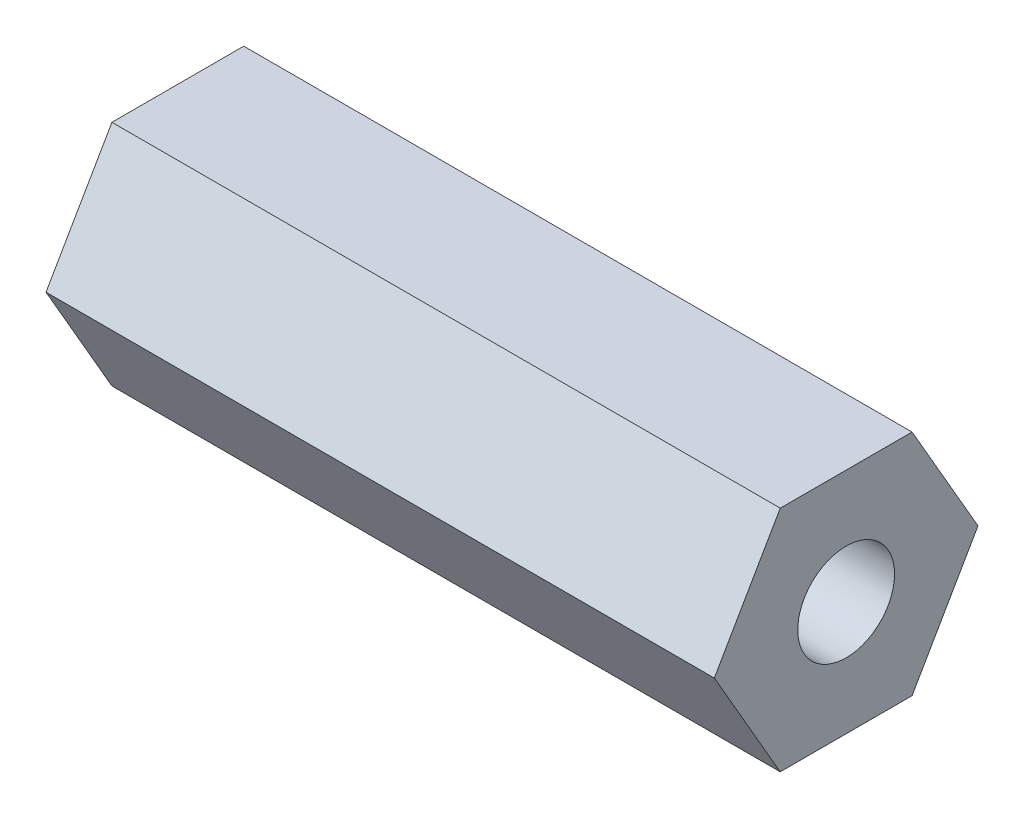
ISO-10303-21;
HEADER;
FILE_DESCRIPTION(('STEP AP214'),'2;1');
FILE_NAME('part.step','',(''),(''),'','','');
FILE_SCHEMA(('AUTOMOTIVE_DESIGN { 1 0 10303 214 1 1 1 1 }'));
ENDSEC;
DATA;
#1=APPLICATION_CONTEXT('core data for automotive mechanical design processes');
#2=APPLICATION_PROTOCOL_DEFINITION('international standard','automotive_design',2000,#1);
#3=PRODUCT_CONTEXT('',#1,'mechanical');
#4=PRODUCT('Part','Part','',(#3));
#5=PRODUCT_RELATED_PRODUCT_CATEGORY('part','',(#4));
#6=PRODUCT_DEFINITION_FORMATION('','',#4);
#7=PRODUCT_DEFINITION_CONTEXT('part definition',#1,'design');
#8=PRODUCT_DEFINITION('design','',#6,#7);
#9=PRODUCT_DEFINITION_SHAPE('','',#8);
#10=(LENGTH_UNIT() NAMED_UNIT(*) SI_UNIT(.MILLI.,.METRE.));
#11=(NAMED_UNIT(*) PLANE_ANGLE_UNIT() SI_UNIT($,.RADIAN.));
#12=(NAMED_UNIT(*) SI_UNIT($,.STERADIAN.) SOLID_ANGLE_UNIT());
#13=UNCERTAINTY_MEASURE_WITH_UNIT(LENGTH_MEASURE(1.E-05),#10,'distance_accuracy_value','');
#14=(GEOMETRIC_REPRESENTATION_CONTEXT(3) GLOBAL_UNCERTAINTY_ASSIGNED_CONTEXT((#13)) GLOBAL_UNIT_ASSIGNED_CONTEXT((#10,
#11,#12)) REPRESENTATION_CONTEXT('',''));
#15=CARTESIAN_POINT('',(0.,0.,0.));
#16=DIRECTION('',(0.,0.,1.));
#17=DIRECTION('',(1.,0.,0.));
#18=AXIS2_PLACEMENT_3D('',#15,#16,#17);
#19=CARTESIAN_POINT('',(38.1,0.,0.));
#20=DIRECTION('',(1.,0.,0.));
#21=DIRECTION('',(0.,1.,0.));
#22=AXIS2_PLACEMENT_3D('',#19,#20,#21);
#23=PLANE('',#22);
#24=CARTESIAN_POINT('',(38.1,0.,0.));
#25=DIRECTION('',(1.,0.,0.));
#26=DIRECTION('',(0.,0.,-1.));
#27=AXIS2_PLACEMENT_3D('',#24,#25,#26);
#28=CIRCLE('',#27,2.0193);
#29=CARTESIAN_POINT('',(38.1,0.,-2.0193));
#30=VERTEX_POINT('',#29);
#31=EDGE_CURVE('E119',#30,#30,#28,.T.);
#32=ORIENTED_EDGE('',*,*,#31,.F.);
#33=EDGE_LOOP('',(#32));
#34=FACE_BOUND('',#33,.T.);
#35=DIRECTION('',(0.,0.866025403784442,-0.5));
#36=VECTOR('',#35,1.);
#37=CARTESIAN_POINT('',(38.1,-4.7625,-2.74963065701564));
#38=LINE('',#37,#36);
#39=CARTESIAN_POINT('',(38.1,-4.7625,-2.74963065701564));
#40=VERTEX_POINT('',#39);
#41=CARTESIAN_POINT('',(38.1,0.,-5.49926131403117));
#42=VERTEX_POINT('',#41);
#43=EDGE_CURVE('E143',#40,#42,#38,.T.);
#44=ORIENTED_EDGE('',*,*,#43,.T.);
#45=DIRECTION('',(0.,0.866025403784438,0.5));
#46=VECTOR('',#45,1.);
#47=CARTESIAN_POINT('',(38.1,0.,-5.49926131403117));
#48=LINE('',#47,#46);
#49=CARTESIAN_POINT('',(38.1,4.7625,-2.74963065701557));
#50=VERTEX_POINT('',#49);
#51=EDGE_CURVE('E93',#42,#50,#48,.T.);
#52=ORIENTED_EDGE('',*,*,#51,.T.);
#53=DIRECTION('',(0.,0.,1.));
#54=VECTOR('',#53,1.);
#55=CARTESIAN_POINT('',(38.1,4.7625,-2.74963065701557));
#56=LINE('',#55,#54);
#57=CARTESIAN_POINT('',(38.1,4.7625,2.7496306570156));
#58=VERTEX_POINT('',#57);
#59=EDGE_CURVE('E132',#50,#58,#56,.T.);
#60=ORIENTED_EDGE('',*,*,#59,.T.);
#61=DIRECTION('',(0.,-0.866025403784442,0.5));
#62=VECTOR('',#61,1.);
#63=CARTESIAN_POINT('',(38.1,4.7625,2.7496306570156));
#64=LINE('',#63,#62);
#65=CARTESIAN_POINT('',(38.1,0.,5.49926131403117));
#66=VERTEX_POINT('',#65);
#67=EDGE_CURVE('E131',#58,#66,#64,.T.);
#68=ORIENTED_EDGE('',*,*,#67,.T.);
#69=DIRECTION('',(0.,-0.866025403784435,-0.500000000000007));
#70=VECTOR('',#69,1.);
#71=CARTESIAN_POINT('',(38.1,0.,5.49926131403117));
#72=LINE('',#71,#70);
#73=CARTESIAN_POINT('',(38.1,-4.7625,2.74963065701554));
#74=VERTEX_POINT('',#73);
#75=EDGE_CURVE('E50',#66,#74,#72,.T.);
#76=ORIENTED_EDGE('',*,*,#75,.T.);
#77=DIRECTION('',(0.,0.,-1.));
#78=VECTOR('',#77,1.);
#79=CARTESIAN_POINT('',(38.1,-4.7625,2.74963065701554));
#80=LINE('',#79,#78);
#81=EDGE_CURVE('E11',#74,#40,#80,.T.);
#82=ORIENTED_EDGE('',*,*,#81,.T.);
#83=EDGE_LOOP('',(#44,#52,#60,#68,#76,#82));
#84=FACE_BOUND('',#83,.T.);
#85=ADVANCED_FACE('F40',(#34,#84),#23,.T.);
#86=CARTESIAN_POINT('',(38.1,-4.7625,2.74963065701554));
#87=DIRECTION('',(0.,1.,0.));
#88=DIRECTION('',(0.,0.,-1.));
#89=AXIS2_PLACEMENT_3D('',#86,#87,#88);
#90=PLANE('',#89);
#91=DIRECTION('',(-1.,0.,0.));
#92=VECTOR('',#91,1.);
#93=CARTESIAN_POINT('',(38.1,-4.7625,2.74963065701554));
#94=LINE('',#93,#92);
#95=CARTESIAN_POINT('',(10.2235,-4.7625,2.74963065701555));
#96=VERTEX_POINT('',#95);
#97=EDGE_CURVE('E137',#74,#96,#94,.T.);
#98=ORIENTED_EDGE('',*,*,#97,.T.);
#99=DIRECTION('',(0.,0.,-1.));
#100=VECTOR('',#99,1.);
#101=CARTESIAN_POINT('',(10.2235,-4.7625,2.74963065701554));
#102=LINE('',#101,#100);
#103=CARTESIAN_POINT('',(10.2235,-4.7625,-2.74963065701564));
#104=VERTEX_POINT('',#103);
#105=EDGE_CURVE('E115',#96,#104,#102,.T.);
#106=ORIENTED_EDGE('',*,*,#105,.T.);
#107=DIRECTION('',(-1.,0.,0.));
#108=VECTOR('',#107,1.);
#109=CARTESIAN_POINT('',(38.1,-4.7625,-2.74963065701564));
#110=LINE('',#109,#108);
#111=EDGE_CURVE('E146',#40,#104,#110,.T.);
#112=ORIENTED_EDGE('',*,*,#111,.F.);
#113=ORIENTED_EDGE('',*,*,#81,.F.);
#114=EDGE_LOOP('',(#98,#106,#112,#113));
#115=FACE_BOUND('',#114,.T.);
#116=ADVANCED_FACE('F169',(#115),#90,.F.);
#117=CARTESIAN_POINT('',(38.1,0.,5.49926131403117));
#118=DIRECTION('',(0.,0.500000000000007,-0.866025403784435));
#119=DIRECTION('',(-1.,0.,0.));
#120=AXIS2_PLACEMENT_3D('',#117,#118,#119);
#121=PLANE('',#120);
#122=DIRECTION('',(-1.,0.,0.));
#123=VECTOR('',#122,1.);
#124=CARTESIAN_POINT('',(38.1,0.,5.49926131403117));
#125=LINE('',#124,#123);
#126=CARTESIAN_POINT('',(10.2235,0.,5.49926131403121));
#127=VERTEX_POINT('',#126);
#128=EDGE_CURVE('E125',#66,#127,#125,.T.);
#129=ORIENTED_EDGE('',*,*,#128,.T.);
#130=DIRECTION('',(0.,-0.866025403784435,-0.500000000000007));
#131=VECTOR('',#130,1.);
#132=CARTESIAN_POINT('',(10.2235,0.,5.49926131403117));
#133=LINE('',#132,#131);
#134=EDGE_CURVE('E109',#127,#96,#133,.T.);
#135=ORIENTED_EDGE('',*,*,#134,.T.);
#136=ORIENTED_EDGE('',*,*,#97,.F.);
#137=ORIENTED_EDGE('',*,*,#75,.F.);
#138=EDGE_LOOP('',(#129,#135,#136,#137));
#139=FACE_BOUND('',#138,.T.);
#140=ADVANCED_FACE('F42',(#139),#121,.F.);
#141=CARTESIAN_POINT('',(38.1,4.7625,2.7496306570156));
#142=DIRECTION('',(0.,-0.5,-0.866025403784442));
#143=DIRECTION('',(0.,-0.866025403784442,0.5));
#144=AXIS2_PLACEMENT_3D('',#141,#142,#143);
#145=PLANE('',#144);
#146=DIRECTION('',(-1.,0.,0.));
#147=VECTOR('',#146,1.);
#148=CARTESIAN_POINT('',(38.1,4.7625,2.7496306570156));
#149=LINE('',#148,#147);
#150=CARTESIAN_POINT('',(10.2235,4.76249999999998,2.74963065701562));
#151=VERTEX_POINT('',#150);
#152=EDGE_CURVE('E127',#58,#151,#149,.T.);
#153=ORIENTED_EDGE('',*,*,#152,.T.);
#154=DIRECTION('',(0.,0.866025403784439,-0.499999999999998));
#155=VECTOR('',#154,1.);
#156=CARTESIAN_POINT('',(10.2235,7.14374999999999,1.37481532850782));
#157=LINE('',#156,#155);
#158=EDGE_CURVE('E112',#127,#151,#157,.T.);
#159=ORIENTED_EDGE('',*,*,#158,.F.);
#160=ORIENTED_EDGE('',*,*,#128,.F.);
#161=ORIENTED_EDGE('',*,*,#67,.F.);
#162=EDGE_LOOP('',(#153,#159,#160,#161));
#163=FACE_BOUND('',#162,.T.);
#164=ADVANCED_FACE('F124',(#163),#145,.F.);
#165=CARTESIAN_POINT('',(38.1,4.7625,-2.74963065701557));
#166=DIRECTION('',(0.,-1.,0.));
#167=DIRECTION('',(0.,0.,-1.));
#168=AXIS2_PLACEMENT_3D('',#165,#166,#167);
#169=PLANE('',#168);
#170=DIRECTION('',(-1.,0.,0.));
#171=VECTOR('',#170,1.);
#172=CARTESIAN_POINT('',(38.1,4.7625,-2.74963065701557));
#173=LINE('',#172,#171);
#174=CARTESIAN_POINT('',(10.2235,4.7625,-2.74963065701558));
#175=VERTEX_POINT('',#174);
#176=EDGE_CURVE('E164',#50,#175,#173,.T.);
#177=ORIENTED_EDGE('',*,*,#176,.T.);
#178=DIRECTION('',(0.,0.,1.));
#179=VECTOR('',#178,1.);
#180=CARTESIAN_POINT('',(10.2235,4.7625,-2.74963065701557));
#181=LINE('',#180,#179);
#182=EDGE_CURVE('E172',#175,#151,#181,.T.);
#183=ORIENTED_EDGE('',*,*,#182,.T.);
#184=ORIENTED_EDGE('',*,*,#152,.F.);
#185=ORIENTED_EDGE('',*,*,#59,.F.);
#186=EDGE_LOOP('',(#177,#183,#184,#185));
#187=FACE_BOUND('',#186,.T.);
#188=ADVANCED_FACE('F205',(#187),#169,.F.);
#189=CARTESIAN_POINT('',(38.1,0.,-5.49926131403117));
#190=DIRECTION('',(0.,-0.5,0.866025403784438));
#191=DIRECTION('',(-1.,0.,0.));
#192=AXIS2_PLACEMENT_3D('',#189,#190,#191);
#193=PLANE('',#192);
#194=DIRECTION('',(-1.,0.,0.));
#195=VECTOR('',#194,1.);
#196=CARTESIAN_POINT('',(38.1,0.,-5.49926131403117));
#197=LINE('',#196,#195);
#198=CARTESIAN_POINT('',(10.2235,0.,-5.49926131403117));
#199=VERTEX_POINT('',#198);
#200=EDGE_CURVE('E147',#42,#199,#197,.T.);
#201=ORIENTED_EDGE('',*,*,#200,.T.);
#202=DIRECTION('',(0.,0.866025403784438,0.5));
#203=VECTOR('',#202,1.);
#204=CARTESIAN_POINT('',(10.2235,0.,-5.49926131403117));
#205=LINE('',#204,#203);
#206=EDGE_CURVE('E58',#199,#175,#205,.T.);
#207=ORIENTED_EDGE('',*,*,#206,.T.);
#208=ORIENTED_EDGE('',*,*,#176,.F.);
#209=ORIENTED_EDGE('',*,*,#51,.F.);
#210=EDGE_LOOP('',(#201,#207,#208,#209));
#211=FACE_BOUND('',#210,.T.);
#212=ADVANCED_FACE('F209',(#211),#193,.F.);
#213=CARTESIAN_POINT('',(38.1,-4.7625,-2.74963065701564));
#214=DIRECTION('',(0.,0.5,0.866025403784442));
#215=DIRECTION('',(1.,0.,0.));
#216=AXIS2_PLACEMENT_3D('',#213,#214,#215);
#217=PLANE('',#216);
#218=ORIENTED_EDGE('',*,*,#111,.T.);
#219=DIRECTION('',(0.,0.866025403784439,-0.499999999999999));
#220=VECTOR('',#219,1.);
#221=CARTESIAN_POINT('',(10.2235,-4.7625,-2.74963065701564));
#222=LINE('',#221,#220);
#223=EDGE_CURVE('E176',#104,#199,#222,.T.);
#224=ORIENTED_EDGE('',*,*,#223,.T.);
#225=ORIENTED_EDGE('',*,*,#200,.F.);
#226=ORIENTED_EDGE('',*,*,#43,.F.);
#227=EDGE_LOOP('',(#218,#224,#225,#226));
#228=FACE_BOUND('',#227,.T.);
#229=ADVANCED_FACE('F175',(#228),#217,.F.);
#230=CARTESIAN_POINT('',(-38.1,0.,0.));
#231=DIRECTION('',(-1.,0.,0.));
#232=DIRECTION('',(0.,0.,1.));
#233=AXIS2_PLACEMENT_3D('',#230,#231,#232);
#234=CYLINDRICAL_SURFACE('',#233,2.0193);
#235=CARTESIAN_POINT('',(10.2235,0.,0.));
#236=DIRECTION('',(1.,0.,0.));
#237=DIRECTION('',(0.,0.,-1.));
#238=AXIS2_PLACEMENT_3D('',#235,#236,#237);
#239=CIRCLE('',#238,2.0193);
#240=CARTESIAN_POINT('',(10.2235,0.,-2.0193));
#241=VERTEX_POINT('',#240);
#242=EDGE_CURVE('E44',#241,#241,#239,.F.);
#243=ORIENTED_EDGE('',*,*,#242,.T.);
#244=EDGE_LOOP('',(#243));
#245=FACE_BOUND('',#244,.T.);
#246=ORIENTED_EDGE('',*,*,#31,.T.);
#247=EDGE_LOOP('',(#246));
#248=FACE_BOUND('',#247,.T.);
#249=ADVANCED_FACE('F188',(#245,#248),#234,.F.);
#250=CARTESIAN_POINT('',(10.2235,1.19062500000001,-8.93629963530066));
#251=DIRECTION('',(1.,0.,0.));
#252=DIRECTION('',(0.,0.,-1.));
#253=AXIS2_PLACEMENT_3D('',#250,#251,#252);
#254=PLANE('',#253);
#255=ORIENTED_EDGE('',*,*,#242,.F.);
#256=EDGE_LOOP('',(#255));
#257=FACE_BOUND('',#256,.T.);
#258=ORIENTED_EDGE('',*,*,#158,.T.);
#259=ORIENTED_EDGE('',*,*,#182,.F.);
#260=ORIENTED_EDGE('',*,*,#206,.F.);
#261=ORIENTED_EDGE('',*,*,#223,.F.);
#262=ORIENTED_EDGE('',*,*,#105,.F.);
#263=ORIENTED_EDGE('',*,*,#134,.F.);
#264=EDGE_LOOP('',(#258,#259,#260,#261,#262,#263));
#265=FACE_BOUND('',#264,.T.);
#266=ADVANCED_FACE('F111',(#257,#265),#254,.F.);
#267=CLOSED_SHELL('',(#85,#116,#140,#164,#188,#212,#229,#249,#266));
#268=MANIFOLD_SOLID_BREP('B2',#267);
#269=ADVANCED_BREP_SHAPE_REPRESENTATION('',(#18,#268),#14);
#270=SHAPE_DEFINITION_REPRESENTATION(#9,#269);
ENDSEC;
END-ISO-10303-21;
